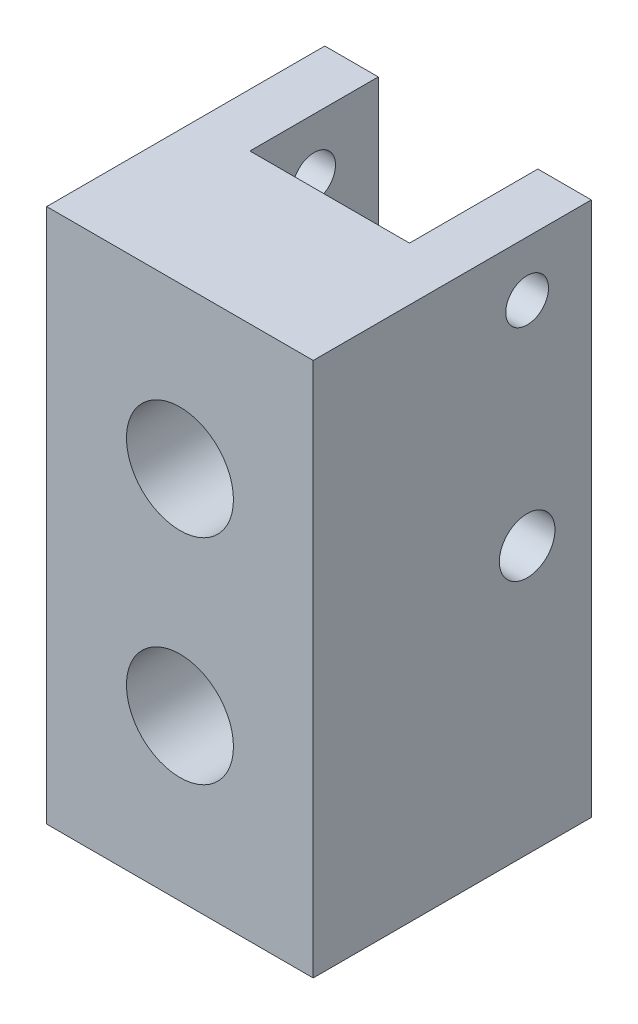
ISO-10303-21;
HEADER;
FILE_DESCRIPTION(('STEP AP214'),'2;1');
FILE_NAME('part.step','',(''),(''),'','','');
FILE_SCHEMA(('AUTOMOTIVE_DESIGN { 1 0 10303 214 1 1 1 1 }'));
ENDSEC;
DATA;
#1=APPLICATION_CONTEXT('core data for automotive mechanical design processes');
#2=APPLICATION_PROTOCOL_DEFINITION('international standard','automotive_design',2000,#1);
#3=PRODUCT_CONTEXT('',#1,'mechanical');
#4=PRODUCT('Part','Part','',(#3));
#5=PRODUCT_RELATED_PRODUCT_CATEGORY('part','',(#4));
#6=PRODUCT_DEFINITION_FORMATION('','',#4);
#7=PRODUCT_DEFINITION_CONTEXT('part definition',#1,'design');
#8=PRODUCT_DEFINITION('design','',#6,#7);
#9=PRODUCT_DEFINITION_SHAPE('','',#8);
#10=(LENGTH_UNIT() NAMED_UNIT(*) SI_UNIT(.MILLI.,.METRE.));
#11=(NAMED_UNIT(*) PLANE_ANGLE_UNIT() SI_UNIT($,.RADIAN.));
#12=(NAMED_UNIT(*) SI_UNIT($,.STERADIAN.) SOLID_ANGLE_UNIT());
#13=UNCERTAINTY_MEASURE_WITH_UNIT(LENGTH_MEASURE(1.E-05),#10,'distance_accuracy_value','');
#14=(GEOMETRIC_REPRESENTATION_CONTEXT(3) GLOBAL_UNCERTAINTY_ASSIGNED_CONTEXT((#13)) GLOBAL_UNIT_ASSIGNED_CONTEXT((#10,
#11,#12)) REPRESENTATION_CONTEXT('',''));
#15=CARTESIAN_POINT('',(0.,0.,0.));
#16=DIRECTION('',(0.,0.,1.));
#17=DIRECTION('',(1.,0.,0.));
#18=AXIS2_PLACEMENT_3D('',#15,#16,#17);
#19=CARTESIAN_POINT('',(31.6444206666666,63.5,0.));
#20=DIRECTION('',(0.,0.,-1.));
#21=DIRECTION('',(-1.,0.,0.));
#22=AXIS2_PLACEMENT_3D('',#19,#20,#21);
#23=PLANE('',#22);
#24=CARTESIAN_POINT('',(15.8222103333333,44.45,0.));
#25=DIRECTION('',(0.,0.,1.));
#26=DIRECTION('',(1.,0.,0.));
#27=AXIS2_PLACEMENT_3D('',#24,#25,#26);
#28=CIRCLE('',#27,6.35);
#29=CARTESIAN_POINT('',(22.1722103333333,44.45,0.));
#30=VERTEX_POINT('',#29);
#31=EDGE_CURVE('E188',#30,#30,#28,.T.);
#32=ORIENTED_EDGE('',*,*,#31,.F.);
#33=EDGE_LOOP('',(#32));
#34=FACE_BOUND('',#33,.T.);
#35=CARTESIAN_POINT('',(15.8222103333333,19.05,0.));
#36=DIRECTION('',(0.,0.,1.));
#37=DIRECTION('',(1.,0.,0.));
#38=AXIS2_PLACEMENT_3D('',#35,#36,#37);
#39=CIRCLE('',#38,6.35);
#40=CARTESIAN_POINT('',(22.1722103333333,19.05,0.));
#41=VERTEX_POINT('',#40);
#42=EDGE_CURVE('E195',#41,#41,#39,.T.);
#43=ORIENTED_EDGE('',*,*,#42,.F.);
#44=EDGE_LOOP('',(#43));
#45=FACE_BOUND('',#44,.T.);
#46=DIRECTION('',(1.,0.,0.));
#47=VECTOR('',#46,1.);
#48=CARTESIAN_POINT('',(31.6444206666666,0.,0.));
#49=LINE('',#48,#47);
#50=CARTESIAN_POINT('',(0.,0.,0.));
#51=VERTEX_POINT('',#50);
#52=CARTESIAN_POINT('',(31.6444206666666,0.,0.));
#53=VERTEX_POINT('',#52);
#54=EDGE_CURVE('E146',#51,#53,#49,.T.);
#55=ORIENTED_EDGE('',*,*,#54,.T.);
#56=DIRECTION('',(0.,-1.,0.));
#57=VECTOR('',#56,1.);
#58=CARTESIAN_POINT('',(31.6444206666666,63.5,0.));
#59=LINE('',#58,#57);
#60=CARTESIAN_POINT('',(31.6444206666666,63.5,0.));
#61=VERTEX_POINT('',#60);
#62=EDGE_CURVE('E11',#61,#53,#59,.T.);
#63=ORIENTED_EDGE('',*,*,#62,.F.);
#64=DIRECTION('',(1.,0.,0.));
#65=VECTOR('',#64,1.);
#66=CARTESIAN_POINT('',(31.6444206666666,63.5,0.));
#67=LINE('',#66,#65);
#68=CARTESIAN_POINT('',(0.,63.5,0.));
#69=VERTEX_POINT('',#68);
#70=EDGE_CURVE('E168',#69,#61,#67,.T.);
#71=ORIENTED_EDGE('',*,*,#70,.F.);
#72=DIRECTION('',(0.,-1.,0.));
#73=VECTOR('',#72,1.);
#74=CARTESIAN_POINT('',(0.,63.5,0.));
#75=LINE('',#74,#73);
#76=EDGE_CURVE('E142',#69,#51,#75,.T.);
#77=ORIENTED_EDGE('',*,*,#76,.T.);
#78=EDGE_LOOP('',(#55,#63,#71,#77));
#79=FACE_BOUND('',#78,.T.);
#80=ADVANCED_FACE('F43',(#34,#45,#79),#23,.F.);
#81=CARTESIAN_POINT('',(31.6444206666666,63.5,0.));
#82=DIRECTION('',(-1.,0.,0.));
#83=DIRECTION('',(0.,0.,1.));
#84=AXIS2_PLACEMENT_3D('',#81,#82,#83);
#85=PLANE('',#84);
#86=CARTESIAN_POINT('',(31.6444206666666,31.75,-25.4));
#87=DIRECTION('',(1.,0.,0.));
#88=DIRECTION('',(0.,0.,-1.));
#89=AXIS2_PLACEMENT_3D('',#86,#87,#88);
#90=CIRCLE('',#89,3.302);
#91=CARTESIAN_POINT('',(31.6444206666666,31.75,-28.702));
#92=VERTEX_POINT('',#91);
#93=EDGE_CURVE('E310',#92,#92,#90,.T.);
#94=ORIENTED_EDGE('',*,*,#93,.F.);
#95=EDGE_LOOP('',(#94));
#96=FACE_BOUND('',#95,.T.);
#97=CARTESIAN_POINT('',(31.6444206666666,56.9899924781986,-25.4));
#98=DIRECTION('',(1.,0.,0.));
#99=DIRECTION('',(0.,0.,-1.));
#100=AXIS2_PLACEMENT_3D('',#97,#98,#99);
#101=CIRCLE('',#100,2.54);
#102=CARTESIAN_POINT('',(31.6444206666666,56.9899924781986,-27.94));
#103=VERTEX_POINT('',#102);
#104=EDGE_CURVE('E311',#103,#103,#101,.T.);
#105=ORIENTED_EDGE('',*,*,#104,.F.);
#106=EDGE_LOOP('',(#105));
#107=FACE_BOUND('',#106,.T.);
#108=DIRECTION('',(0.,0.,-1.));
#109=VECTOR('',#108,1.);
#110=CARTESIAN_POINT('',(31.6444206666666,0.,0.));
#111=LINE('',#110,#109);
#112=CARTESIAN_POINT('',(31.6444206666666,0.,-33.02));
#113=VERTEX_POINT('',#112);
#114=EDGE_CURVE('E150',#53,#113,#111,.T.);
#115=ORIENTED_EDGE('',*,*,#114,.T.);
#116=DIRECTION('',(0.,-1.,0.));
#117=VECTOR('',#116,1.);
#118=CARTESIAN_POINT('',(31.6444206666666,63.5,-33.02));
#119=LINE('',#118,#117);
#120=CARTESIAN_POINT('',(31.6444206666666,63.5,-33.02));
#121=VERTEX_POINT('',#120);
#122=EDGE_CURVE('E53',#121,#113,#119,.T.);
#123=ORIENTED_EDGE('',*,*,#122,.F.);
#124=DIRECTION('',(0.,0.,-1.));
#125=VECTOR('',#124,1.);
#126=CARTESIAN_POINT('',(31.6444206666666,63.5,0.));
#127=LINE('',#126,#125);
#128=EDGE_CURVE('E105',#61,#121,#127,.T.);
#129=ORIENTED_EDGE('',*,*,#128,.F.);
#130=ORIENTED_EDGE('',*,*,#62,.T.);
#131=EDGE_LOOP('',(#115,#123,#129,#130));
#132=FACE_BOUND('',#131,.T.);
#133=ADVANCED_FACE('F247',(#96,#107,#132),#85,.F.);
#134=CARTESIAN_POINT('',(31.6444206666666,63.5,-33.02));
#135=DIRECTION('',(0.,0.,1.));
#136=DIRECTION('',(1.,0.,0.));
#137=AXIS2_PLACEMENT_3D('',#134,#135,#136);
#138=PLANE('',#137);
#139=DIRECTION('',(-1.,0.,0.));
#140=VECTOR('',#139,1.);
#141=CARTESIAN_POINT('',(31.6444206666666,0.,-33.02));
#142=LINE('',#141,#140);
#143=CARTESIAN_POINT('',(25.2944206666666,0.,-33.02));
#144=VERTEX_POINT('',#143);
#145=EDGE_CURVE('E153',#113,#144,#142,.T.);
#146=ORIENTED_EDGE('',*,*,#145,.T.);
#147=DIRECTION('',(0.,-1.,0.));
#148=VECTOR('',#147,1.);
#149=CARTESIAN_POINT('',(25.2944206666666,63.5,-33.02));
#150=LINE('',#149,#148);
#151=CARTESIAN_POINT('',(25.2944206666666,63.5,-33.02));
#152=VERTEX_POINT('',#151);
#153=EDGE_CURVE('E179',#152,#144,#150,.T.);
#154=ORIENTED_EDGE('',*,*,#153,.F.);
#155=DIRECTION('',(-1.,0.,0.));
#156=VECTOR('',#155,1.);
#157=CARTESIAN_POINT('',(31.6444206666666,63.5,-33.02));
#158=LINE('',#157,#156);
#159=EDGE_CURVE('E210',#121,#152,#158,.T.);
#160=ORIENTED_EDGE('',*,*,#159,.F.);
#161=ORIENTED_EDGE('',*,*,#122,.T.);
#162=EDGE_LOOP('',(#146,#154,#160,#161));
#163=FACE_BOUND('',#162,.T.);
#164=ADVANCED_FACE('F252',(#163),#138,.F.);
#165=CARTESIAN_POINT('',(25.2944206666666,63.5,-33.02));
#166=DIRECTION('',(1.,0.,0.));
#167=DIRECTION('',(0.,0.,-1.));
#168=AXIS2_PLACEMENT_3D('',#165,#166,#167);
#169=PLANE('',#168);
#170=CARTESIAN_POINT('',(25.2944206666666,31.75,-25.4));
#171=DIRECTION('',(1.,0.,0.));
#172=DIRECTION('',(0.,0.,-1.));
#173=AXIS2_PLACEMENT_3D('',#170,#171,#172);
#174=CIRCLE('',#173,3.302);
#175=CARTESIAN_POINT('',(25.2944206666666,31.75,-28.702));
#176=VERTEX_POINT('',#175);
#177=EDGE_CURVE('E201',#176,#176,#174,.T.);
#178=ORIENTED_EDGE('',*,*,#177,.T.);
#179=EDGE_LOOP('',(#178));
#180=FACE_BOUND('',#179,.T.);
#181=CARTESIAN_POINT('',(25.2944206666666,56.9899924781986,-25.4));
#182=DIRECTION('',(1.,0.,0.));
#183=DIRECTION('',(0.,0.,-1.));
#184=AXIS2_PLACEMENT_3D('',#181,#182,#183);
#185=CIRCLE('',#184,2.54);
#186=CARTESIAN_POINT('',(25.2944206666666,56.9899924781986,-27.94));
#187=VERTEX_POINT('',#186);
#188=EDGE_CURVE('E295',#187,#187,#185,.T.);
#189=ORIENTED_EDGE('',*,*,#188,.T.);
#190=EDGE_LOOP('',(#189));
#191=FACE_BOUND('',#190,.T.);
#192=DIRECTION('',(0.,0.,1.));
#193=VECTOR('',#192,1.);
#194=CARTESIAN_POINT('',(25.2944206666666,0.,-33.02));
#195=LINE('',#194,#193);
#196=CARTESIAN_POINT('',(25.2944206666666,0.,-17.78));
#197=VERTEX_POINT('',#196);
#198=EDGE_CURVE('E156',#144,#197,#195,.T.);
#199=ORIENTED_EDGE('',*,*,#198,.T.);
#200=DIRECTION('',(0.,-1.,0.));
#201=VECTOR('',#200,1.);
#202=CARTESIAN_POINT('',(25.2944206666666,63.5,-17.78));
#203=LINE('',#202,#201);
#204=CARTESIAN_POINT('',(25.2944206666666,63.5,-17.78));
#205=VERTEX_POINT('',#204);
#206=EDGE_CURVE('E175',#205,#197,#203,.T.);
#207=ORIENTED_EDGE('',*,*,#206,.F.);
#208=DIRECTION('',(0.,0.,1.));
#209=VECTOR('',#208,1.);
#210=CARTESIAN_POINT('',(25.2944206666666,63.5,-33.02));
#211=LINE('',#210,#209);
#212=EDGE_CURVE('E213',#152,#205,#211,.T.);
#213=ORIENTED_EDGE('',*,*,#212,.F.);
#214=ORIENTED_EDGE('',*,*,#153,.T.);
#215=EDGE_LOOP('',(#199,#207,#213,#214));
#216=FACE_BOUND('',#215,.T.);
#217=ADVANCED_FACE('F221',(#180,#191,#216),#169,.F.);
#218=CARTESIAN_POINT('',(6.35,63.5,-17.78));
#219=DIRECTION('',(0.,0.,1.));
#220=DIRECTION('',(1.,0.,0.));
#221=AXIS2_PLACEMENT_3D('',#218,#219,#220);
#222=PLANE('',#221);
#223=CARTESIAN_POINT('',(15.8222103333333,44.45,-17.78));
#224=DIRECTION('',(0.,0.,1.));
#225=DIRECTION('',(1.,0.,0.));
#226=AXIS2_PLACEMENT_3D('',#223,#224,#225);
#227=CIRCLE('',#226,6.35);
#228=CARTESIAN_POINT('',(22.1722103333333,44.45,-17.78));
#229=VERTEX_POINT('',#228);
#230=EDGE_CURVE('E46',#229,#229,#227,.T.);
#231=ORIENTED_EDGE('',*,*,#230,.T.);
#232=EDGE_LOOP('',(#231));
#233=FACE_BOUND('',#232,.T.);
#234=CARTESIAN_POINT('',(15.8222103333333,19.05,-17.78));
#235=DIRECTION('',(0.,0.,1.));
#236=DIRECTION('',(1.,0.,0.));
#237=AXIS2_PLACEMENT_3D('',#234,#235,#236);
#238=CIRCLE('',#237,6.35);
#239=CARTESIAN_POINT('',(22.1722103333333,19.05,-17.78));
#240=VERTEX_POINT('',#239);
#241=EDGE_CURVE('E185',#240,#240,#238,.T.);
#242=ORIENTED_EDGE('',*,*,#241,.T.);
#243=EDGE_LOOP('',(#242));
#244=FACE_BOUND('',#243,.T.);
#245=DIRECTION('',(-1.,0.,0.));
#246=VECTOR('',#245,1.);
#247=CARTESIAN_POINT('',(6.35,0.,-17.78));
#248=LINE('',#247,#246);
#249=CARTESIAN_POINT('',(6.35,0.,-17.78));
#250=VERTEX_POINT('',#249);
#251=EDGE_CURVE('E159',#197,#250,#248,.T.);
#252=ORIENTED_EDGE('',*,*,#251,.T.);
#253=DIRECTION('',(0.,-1.,0.));
#254=VECTOR('',#253,1.);
#255=CARTESIAN_POINT('',(6.35,63.5,-17.78));
#256=LINE('',#255,#254);
#257=CARTESIAN_POINT('',(6.35,63.5,-17.78));
#258=VERTEX_POINT('',#257);
#259=EDGE_CURVE('E135',#258,#250,#256,.T.);
#260=ORIENTED_EDGE('',*,*,#259,.F.);
#261=DIRECTION('',(-1.,0.,0.));
#262=VECTOR('',#261,1.);
#263=CARTESIAN_POINT('',(6.35,63.5,-17.78));
#264=LINE('',#263,#262);
#265=EDGE_CURVE('E124',#205,#258,#264,.T.);
#266=ORIENTED_EDGE('',*,*,#265,.F.);
#267=ORIENTED_EDGE('',*,*,#206,.T.);
#268=EDGE_LOOP('',(#252,#260,#266,#267));
#269=FACE_BOUND('',#268,.T.);
#270=ADVANCED_FACE('F225',(#233,#244,#269),#222,.F.);
#271=CARTESIAN_POINT('',(6.35,63.5,-33.02));
#272=DIRECTION('',(-1.,0.,0.));
#273=DIRECTION('',(0.,0.,1.));
#274=AXIS2_PLACEMENT_3D('',#271,#272,#273);
#275=PLANE('',#274);
#276=CARTESIAN_POINT('',(6.35,31.75,-25.4));
#277=DIRECTION('',(-1.,0.,0.));
#278=DIRECTION('',(0.,0.,1.));
#279=AXIS2_PLACEMENT_3D('',#276,#277,#278);
#280=CIRCLE('',#279,3.302);
#281=CARTESIAN_POINT('',(6.35,31.75,-28.702));
#282=VERTEX_POINT('',#281);
#283=EDGE_CURVE('E292',#282,#282,#280,.T.);
#284=ORIENTED_EDGE('',*,*,#283,.T.);
#285=EDGE_LOOP('',(#284));
#286=FACE_BOUND('',#285,.T.);
#287=CARTESIAN_POINT('',(6.35,56.9899924781986,-25.4));
#288=DIRECTION('',(-1.,0.,0.));
#289=DIRECTION('',(0.,0.,1.));
#290=AXIS2_PLACEMENT_3D('',#287,#288,#289);
#291=CIRCLE('',#290,2.54);
#292=CARTESIAN_POINT('',(6.35,56.9899924781986,-27.94));
#293=VERTEX_POINT('',#292);
#294=EDGE_CURVE('E300',#293,#293,#291,.T.);
#295=ORIENTED_EDGE('',*,*,#294,.T.);
#296=EDGE_LOOP('',(#295));
#297=FACE_BOUND('',#296,.T.);
#298=DIRECTION('',(0.,0.,-1.));
#299=VECTOR('',#298,1.);
#300=CARTESIAN_POINT('',(6.35,0.,-33.02));
#301=LINE('',#300,#299);
#302=CARTESIAN_POINT('',(6.35,0.,-33.02));
#303=VERTEX_POINT('',#302);
#304=EDGE_CURVE('E133',#250,#303,#301,.T.);
#305=ORIENTED_EDGE('',*,*,#304,.T.);
#306=DIRECTION('',(0.,-1.,0.));
#307=VECTOR('',#306,1.);
#308=CARTESIAN_POINT('',(6.35,63.5,-33.02));
#309=LINE('',#308,#307);
#310=CARTESIAN_POINT('',(6.35,63.5,-33.02));
#311=VERTEX_POINT('',#310);
#312=EDGE_CURVE('E130',#311,#303,#309,.T.);
#313=ORIENTED_EDGE('',*,*,#312,.F.);
#314=DIRECTION('',(0.,0.,-1.));
#315=VECTOR('',#314,1.);
#316=CARTESIAN_POINT('',(6.35,63.5,-33.02));
#317=LINE('',#316,#315);
#318=EDGE_CURVE('E118',#258,#311,#317,.T.);
#319=ORIENTED_EDGE('',*,*,#318,.F.);
#320=ORIENTED_EDGE('',*,*,#259,.T.);
#321=EDGE_LOOP('',(#305,#313,#319,#320));
#322=FACE_BOUND('',#321,.T.);
#323=ADVANCED_FACE('F131',(#286,#297,#322),#275,.F.);
#324=CARTESIAN_POINT('',(0.,63.5,-33.02));
#325=DIRECTION('',(0.,0.,1.));
#326=DIRECTION('',(1.,0.,0.));
#327=AXIS2_PLACEMENT_3D('',#324,#325,#326);
#328=PLANE('',#327);
#329=DIRECTION('',(-1.,0.,0.));
#330=VECTOR('',#329,1.);
#331=CARTESIAN_POINT('',(0.,0.,-33.02));
#332=LINE('',#331,#330);
#333=CARTESIAN_POINT('',(0.,0.,-33.02));
#334=VERTEX_POINT('',#333);
#335=EDGE_CURVE('E91',#303,#334,#332,.T.);
#336=ORIENTED_EDGE('',*,*,#335,.T.);
#337=DIRECTION('',(0.,-1.,0.));
#338=VECTOR('',#337,1.);
#339=CARTESIAN_POINT('',(0.,63.5,-33.02));
#340=LINE('',#339,#338);
#341=CARTESIAN_POINT('',(0.,63.5,-33.02));
#342=VERTEX_POINT('',#341);
#343=EDGE_CURVE('E136',#342,#334,#340,.T.);
#344=ORIENTED_EDGE('',*,*,#343,.F.);
#345=DIRECTION('',(-1.,0.,0.));
#346=VECTOR('',#345,1.);
#347=CARTESIAN_POINT('',(0.,63.5,-33.02));
#348=LINE('',#347,#346);
#349=EDGE_CURVE('E122',#311,#342,#348,.T.);
#350=ORIENTED_EDGE('',*,*,#349,.F.);
#351=ORIENTED_EDGE('',*,*,#312,.T.);
#352=EDGE_LOOP('',(#336,#344,#350,#351));
#353=FACE_BOUND('',#352,.T.);
#354=ADVANCED_FACE('F138',(#353),#328,.F.);
#355=CARTESIAN_POINT('',(0.,63.5,0.));
#356=DIRECTION('',(1.,0.,0.));
#357=DIRECTION('',(0.,0.,-1.));
#358=AXIS2_PLACEMENT_3D('',#355,#356,#357);
#359=PLANE('',#358);
#360=CARTESIAN_POINT('',(0.,31.75,-25.4));
#361=DIRECTION('',(1.,0.,0.));
#362=DIRECTION('',(0.,0.,-1.));
#363=AXIS2_PLACEMENT_3D('',#360,#361,#362);
#364=CIRCLE('',#363,3.302);
#365=CARTESIAN_POINT('',(0.,31.75,-28.702));
#366=VERTEX_POINT('',#365);
#367=EDGE_CURVE('E289',#366,#366,#364,.T.);
#368=ORIENTED_EDGE('',*,*,#367,.T.);
#369=EDGE_LOOP('',(#368));
#370=FACE_BOUND('',#369,.T.);
#371=CARTESIAN_POINT('',(0.,56.9899924781986,-25.4));
#372=DIRECTION('',(1.,0.,0.));
#373=DIRECTION('',(0.,0.,-1.));
#374=AXIS2_PLACEMENT_3D('',#371,#372,#373);
#375=CIRCLE('',#374,2.54);
#376=CARTESIAN_POINT('',(0.,56.9899924781986,-27.94));
#377=VERTEX_POINT('',#376);
#378=EDGE_CURVE('E306',#377,#377,#375,.T.);
#379=ORIENTED_EDGE('',*,*,#378,.T.);
#380=EDGE_LOOP('',(#379));
#381=FACE_BOUND('',#380,.T.);
#382=DIRECTION('',(0.,0.,1.));
#383=VECTOR('',#382,1.);
#384=CARTESIAN_POINT('',(0.,0.,0.));
#385=LINE('',#384,#383);
#386=EDGE_CURVE('E97',#334,#51,#385,.T.);
#387=ORIENTED_EDGE('',*,*,#386,.T.);
#388=ORIENTED_EDGE('',*,*,#76,.F.);
#389=DIRECTION('',(0.,0.,1.));
#390=VECTOR('',#389,1.);
#391=CARTESIAN_POINT('',(0.,63.5,0.));
#392=LINE('',#391,#390);
#393=EDGE_CURVE('E62',#342,#69,#392,.T.);
#394=ORIENTED_EDGE('',*,*,#393,.F.);
#395=ORIENTED_EDGE('',*,*,#343,.T.);
#396=EDGE_LOOP('',(#387,#388,#394,#395));
#397=FACE_BOUND('',#396,.T.);
#398=ADVANCED_FACE('F233',(#370,#381,#397),#359,.F.);
#399=CARTESIAN_POINT('',(0.,63.5,0.));
#400=DIRECTION('',(0.,-1.,0.));
#401=DIRECTION('',(0.,0.,-1.));
#402=AXIS2_PLACEMENT_3D('',#399,#400,#401);
#403=PLANE('',#402);
#404=ORIENTED_EDGE('',*,*,#70,.T.);
#405=ORIENTED_EDGE('',*,*,#128,.T.);
#406=ORIENTED_EDGE('',*,*,#159,.T.);
#407=ORIENTED_EDGE('',*,*,#212,.T.);
#408=ORIENTED_EDGE('',*,*,#265,.T.);
#409=ORIENTED_EDGE('',*,*,#318,.T.);
#410=ORIENTED_EDGE('',*,*,#349,.T.);
#411=ORIENTED_EDGE('',*,*,#393,.T.);
#412=EDGE_LOOP('',(#404,#405,#406,#407,#408,#409,#410,#411));
#413=FACE_BOUND('',#412,.T.);
#414=ADVANCED_FACE('F120',(#413),#403,.F.);
#415=CARTESIAN_POINT('',(0.,0.,0.));
#416=DIRECTION('',(0.,-1.,0.));
#417=DIRECTION('',(0.,0.,-1.));
#418=AXIS2_PLACEMENT_3D('',#415,#416,#417);
#419=PLANE('',#418);
#420=ORIENTED_EDGE('',*,*,#54,.F.);
#421=ORIENTED_EDGE('',*,*,#386,.F.);
#422=ORIENTED_EDGE('',*,*,#335,.F.);
#423=ORIENTED_EDGE('',*,*,#304,.F.);
#424=ORIENTED_EDGE('',*,*,#251,.F.);
#425=ORIENTED_EDGE('',*,*,#198,.F.);
#426=ORIENTED_EDGE('',*,*,#145,.F.);
#427=ORIENTED_EDGE('',*,*,#114,.F.);
#428=EDGE_LOOP('',(#420,#421,#422,#423,#424,#425,#426,#427));
#429=FACE_BOUND('',#428,.T.);
#430=ADVANCED_FACE('F228',(#429),#419,.T.);
#431=CARTESIAN_POINT('',(15.8222103333333,19.05,-33.02));
#432=DIRECTION('',(0.,0.,1.));
#433=DIRECTION('',(1.,0.,0.));
#434=AXIS2_PLACEMENT_3D('',#431,#432,#433);
#435=CYLINDRICAL_SURFACE('',#434,6.35);
#436=ORIENTED_EDGE('',*,*,#42,.T.);
#437=EDGE_LOOP('',(#436));
#438=FACE_BOUND('',#437,.T.);
#439=ORIENTED_EDGE('',*,*,#241,.F.);
#440=EDGE_LOOP('',(#439));
#441=FACE_BOUND('',#440,.T.);
#442=ADVANCED_FACE('F257',(#438,#441),#435,.F.);
#443=CARTESIAN_POINT('',(15.8222103333333,44.45,-33.02));
#444=DIRECTION('',(0.,0.,1.));
#445=DIRECTION('',(1.,0.,0.));
#446=AXIS2_PLACEMENT_3D('',#443,#444,#445);
#447=CYLINDRICAL_SURFACE('',#446,6.35);
#448=ORIENTED_EDGE('',*,*,#31,.T.);
#449=EDGE_LOOP('',(#448));
#450=FACE_BOUND('',#449,.T.);
#451=ORIENTED_EDGE('',*,*,#230,.F.);
#452=EDGE_LOOP('',(#451));
#453=FACE_BOUND('',#452,.T.);
#454=ADVANCED_FACE('F260',(#450,#453),#447,.F.);
#455=CARTESIAN_POINT('',(0.,56.9899924781986,-25.4));
#456=DIRECTION('',(1.,0.,0.));
#457=DIRECTION('',(0.,0.,-1.));
#458=AXIS2_PLACEMENT_3D('',#455,#456,#457);
#459=CYLINDRICAL_SURFACE('',#458,2.54);
#460=CARTESIAN_POINT('',(0.,56.9899924781986,-27.94));
#461=CARTESIAN_POINT('',(0.0661458333333296,56.9899924781986,-27.94));
#462=CARTESIAN_POINT('',(0.132291666666663,56.9899924781986,-27.94));
#463=CARTESIAN_POINT('',(0.26458333333333,56.9899924781986,-27.94));
#464=CARTESIAN_POINT('',(0.330729166666663,56.9899924781986,-27.94));
#465=CARTESIAN_POINT('',(0.46302083333333,56.9899924781986,-27.94));
#466=CARTESIAN_POINT('',(0.529166666666663,56.9899924781986,-27.94));
#467=CARTESIAN_POINT('',(0.66145833333333,56.9899924781986,-27.94));
#468=CARTESIAN_POINT('',(0.727604166666663,56.9899924781986,-27.94));
#469=CARTESIAN_POINT('',(0.85989583333333,56.9899924781986,-27.94));
#470=CARTESIAN_POINT('',(0.926041666666663,56.9899924781986,-27.94));
#471=CARTESIAN_POINT('',(1.05833333333333,56.9899924781986,-27.94));
#472=CARTESIAN_POINT('',(1.12447916666666,56.9899924781986,-27.94));
#473=CARTESIAN_POINT('',(1.25677083333333,56.9899924781986,-27.94));
#474=CARTESIAN_POINT('',(1.32291666666666,56.9899924781986,-27.94));
#475=CARTESIAN_POINT('',(1.45520833333333,56.9899924781986,-27.94));
#476=CARTESIAN_POINT('',(1.52135416666666,56.9899924781986,-27.94));
#477=CARTESIAN_POINT('',(1.65364583333333,56.9899924781986,-27.94));
#478=CARTESIAN_POINT('',(1.71979166666666,56.9899924781986,-27.94));
#479=CARTESIAN_POINT('',(1.85208333333333,56.9899924781986,-27.94));
#480=CARTESIAN_POINT('',(1.91822916666666,56.9899924781986,-27.94));
#481=CARTESIAN_POINT('',(2.05052083333333,56.9899924781986,-27.94));
#482=CARTESIAN_POINT('',(2.11666666666666,56.9899924781986,-27.94));
#483=CARTESIAN_POINT('',(2.24895833333333,56.9899924781986,-27.94));
#484=CARTESIAN_POINT('',(2.31510416666666,56.9899924781986,-27.94));
#485=CARTESIAN_POINT('',(2.44739583333333,56.9899924781986,-27.94));
#486=CARTESIAN_POINT('',(2.51354166666666,56.9899924781986,-27.94));
#487=CARTESIAN_POINT('',(2.64583333333333,56.9899924781986,-27.94));
#488=CARTESIAN_POINT('',(2.71197916666666,56.9899924781986,-27.94));
#489=CARTESIAN_POINT('',(2.84427083333333,56.9899924781986,-27.94));
#490=CARTESIAN_POINT('',(2.91041666666666,56.9899924781986,-27.94));
#491=CARTESIAN_POINT('',(3.04270833333333,56.9899924781986,-27.94));
#492=CARTESIAN_POINT('',(3.10885416666666,56.9899924781986,-27.94));
#493=CARTESIAN_POINT('',(3.24114583333333,56.9899924781986,-27.94));
#494=CARTESIAN_POINT('',(3.30729166666667,56.9899924781986,-27.94));
#495=CARTESIAN_POINT('',(3.43958333333333,56.9899924781986,-27.94));
#496=CARTESIAN_POINT('',(3.50572916666667,56.9899924781986,-27.94));
#497=CARTESIAN_POINT('',(3.63802083333333,56.9899924781986,-27.94));
#498=CARTESIAN_POINT('',(3.70416666666667,56.9899924781986,-27.94));
#499=CARTESIAN_POINT('',(3.83645833333333,56.9899924781986,-27.94));
#500=CARTESIAN_POINT('',(3.90260416666667,56.9899924781986,-27.94));
#501=CARTESIAN_POINT('',(4.03489583333333,56.9899924781986,-27.94));
#502=CARTESIAN_POINT('',(4.10104166666667,56.9899924781986,-27.94));
#503=CARTESIAN_POINT('',(4.23333333333333,56.9899924781986,-27.94));
#504=CARTESIAN_POINT('',(4.29947916666667,56.9899924781986,-27.94));
#505=CARTESIAN_POINT('',(4.43177083333333,56.9899924781986,-27.94));
#506=CARTESIAN_POINT('',(4.49791666666667,56.9899924781986,-27.94));
#507=CARTESIAN_POINT('',(4.63020833333333,56.9899924781986,-27.94));
#508=CARTESIAN_POINT('',(4.69635416666667,56.9899924781986,-27.94));
#509=CARTESIAN_POINT('',(4.82864583333333,56.9899924781986,-27.94));
#510=CARTESIAN_POINT('',(4.89479166666667,56.9899924781986,-27.94));
#511=CARTESIAN_POINT('',(5.02708333333333,56.9899924781986,-27.94));
#512=CARTESIAN_POINT('',(5.09322916666667,56.9899924781986,-27.94));
#513=CARTESIAN_POINT('',(5.22552083333333,56.9899924781986,-27.94));
#514=CARTESIAN_POINT('',(5.29166666666667,56.9899924781986,-27.94));
#515=CARTESIAN_POINT('',(5.42395833333333,56.9899924781986,-27.94));
#516=CARTESIAN_POINT('',(5.49010416666667,56.9899924781986,-27.94));
#517=CARTESIAN_POINT('',(5.62239583333333,56.9899924781986,-27.94));
#518=CARTESIAN_POINT('',(5.68854166666667,56.9899924781986,-27.94));
#519=CARTESIAN_POINT('',(5.82083333333333,56.9899924781986,-27.94));
#520=CARTESIAN_POINT('',(5.88697916666667,56.9899924781986,-27.94));
#521=CARTESIAN_POINT('',(6.01927083333333,56.9899924781986,-27.94));
#522=CARTESIAN_POINT('',(6.08541666666667,56.9899924781986,-27.94));
#523=CARTESIAN_POINT('',(6.21770833333333,56.9899924781986,-27.94));
#524=CARTESIAN_POINT('',(6.28385416666667,56.9899924781986,-27.94));
#525=CARTESIAN_POINT('',(6.35,56.9899924781986,-27.94));
#526=B_SPLINE_CURVE_WITH_KNOTS('',3,(#460,#461,#462,#463,#464,#465,#466,#467,#468,#469,#470,
#471,#472,#473,#474,#475,#476,#477,#478,#479,#480,#481,#482,#483,#484,#485,#486,#487,#488,#489,
#490,#491,#492,#493,#494,#495,#496,#497,#498,#499,#500,#501,#502,#503,#504,#505,#506,#507,#508,
#509,#510,#511,#512,#513,#514,#515,#516,#517,#518,#519,#520,#521,#522,#523,#524,#525),
.UNSPECIFIED.,.F.,.F.,(4,2,2,2,2,2,2,2,2,2,2,2,2,2,2,2,2,2,2,2,2,2,2,2,2,2,2,2,2,2,2,2,4),(0.,
0.1984375,0.396875,0.5953125,0.793750000000001,0.9921875,1.190625,1.3890625,1.5875,1.7859375,
1.984375,2.1828125,2.38125,2.5796875,2.778125,2.9765625,3.175,3.3734375,3.571875,3.7703125,
3.96875,4.1671875,4.365625,4.5640625,4.7625,4.9609375,5.159375,5.3578125,5.55625,5.7546875,
5.953125,6.1515625,6.35),.UNSPECIFIED.);
#527=EDGE_CURVE('BSEAM266',#377,#293,#526,.T.);
#528=ORIENTED_EDGE('',*,*,#378,.F.);
#529=ORIENTED_EDGE('',*,*,#294,.F.);
#530=ORIENTED_EDGE('',*,*,#527,.T.);
#531=ORIENTED_EDGE('',*,*,#527,.F.);
#532=EDGE_LOOP('',(#528,#530,#529,#531));
#533=FACE_BOUND('',#532,.T.);
#534=ADVANCED_FACE('F266',(#533),#459,.F.);
#535=CARTESIAN_POINT('',(0.,31.75,-25.4));
#536=DIRECTION('',(1.,0.,0.));
#537=DIRECTION('',(0.,0.,-1.));
#538=AXIS2_PLACEMENT_3D('',#535,#536,#537);
#539=CYLINDRICAL_SURFACE('',#538,3.302);
#540=CARTESIAN_POINT('',(0.,31.75,-28.702));
#541=CARTESIAN_POINT('',(0.0661458333333296,31.75,-28.702));
#542=CARTESIAN_POINT('',(0.132291666666663,31.75,-28.702));
#543=CARTESIAN_POINT('',(0.26458333333333,31.75,-28.702));
#544=CARTESIAN_POINT('',(0.330729166666663,31.75,-28.702));
#545=CARTESIAN_POINT('',(0.46302083333333,31.75,-28.702));
#546=CARTESIAN_POINT('',(0.529166666666663,31.75,-28.702));
#547=CARTESIAN_POINT('',(0.66145833333333,31.75,-28.702));
#548=CARTESIAN_POINT('',(0.727604166666663,31.75,-28.702));
#549=CARTESIAN_POINT('',(0.85989583333333,31.75,-28.702));
#550=CARTESIAN_POINT('',(0.926041666666664,31.75,-28.702));
#551=CARTESIAN_POINT('',(1.05833333333333,31.75,-28.702));
#552=CARTESIAN_POINT('',(1.12447916666666,31.75,-28.702));
#553=CARTESIAN_POINT('',(1.25677083333333,31.75,-28.702));
#554=CARTESIAN_POINT('',(1.32291666666666,31.75,-28.702));
#555=CARTESIAN_POINT('',(1.45520833333333,31.75,-28.702));
#556=CARTESIAN_POINT('',(1.52135416666666,31.75,-28.702));
#557=CARTESIAN_POINT('',(1.65364583333333,31.75,-28.702));
#558=CARTESIAN_POINT('',(1.71979166666666,31.75,-28.702));
#559=CARTESIAN_POINT('',(1.85208333333333,31.75,-28.702));
#560=CARTESIAN_POINT('',(1.91822916666666,31.75,-28.702));
#561=CARTESIAN_POINT('',(2.05052083333333,31.75,-28.702));
#562=CARTESIAN_POINT('',(2.11666666666666,31.75,-28.702));
#563=CARTESIAN_POINT('',(2.24895833333333,31.75,-28.702));
#564=CARTESIAN_POINT('',(2.31510416666666,31.75,-28.702));
#565=CARTESIAN_POINT('',(2.44739583333333,31.75,-28.702));
#566=CARTESIAN_POINT('',(2.51354166666667,31.75,-28.702));
#567=CARTESIAN_POINT('',(2.64583333333333,31.75,-28.702));
#568=CARTESIAN_POINT('',(2.71197916666667,31.75,-28.702));
#569=CARTESIAN_POINT('',(2.84427083333333,31.75,-28.702));
#570=CARTESIAN_POINT('',(2.91041666666667,31.75,-28.702));
#571=CARTESIAN_POINT('',(3.04270833333333,31.75,-28.702));
#572=CARTESIAN_POINT('',(3.10885416666667,31.75,-28.702));
#573=CARTESIAN_POINT('',(3.24114583333333,31.75,-28.702));
#574=CARTESIAN_POINT('',(3.30729166666667,31.75,-28.702));
#575=CARTESIAN_POINT('',(3.43958333333333,31.75,-28.702));
#576=CARTESIAN_POINT('',(3.50572916666667,31.75,-28.702));
#577=CARTESIAN_POINT('',(3.63802083333333,31.75,-28.702));
#578=CARTESIAN_POINT('',(3.70416666666667,31.75,-28.702));
#579=CARTESIAN_POINT('',(3.83645833333333,31.75,-28.702));
#580=CARTESIAN_POINT('',(3.90260416666667,31.75,-28.702));
#581=CARTESIAN_POINT('',(4.03489583333333,31.75,-28.702));
#582=CARTESIAN_POINT('',(4.10104166666667,31.75,-28.702));
#583=CARTESIAN_POINT('',(4.23333333333333,31.75,-28.702));
#584=CARTESIAN_POINT('',(4.29947916666667,31.75,-28.702));
#585=CARTESIAN_POINT('',(4.43177083333333,31.75,-28.702));
#586=CARTESIAN_POINT('',(4.49791666666667,31.75,-28.702));
#587=CARTESIAN_POINT('',(4.63020833333333,31.75,-28.702));
#588=CARTESIAN_POINT('',(4.69635416666667,31.75,-28.702));
#589=CARTESIAN_POINT('',(4.82864583333333,31.75,-28.702));
#590=CARTESIAN_POINT('',(4.89479166666667,31.75,-28.702));
#591=CARTESIAN_POINT('',(5.02708333333333,31.75,-28.702));
#592=CARTESIAN_POINT('',(5.09322916666667,31.75,-28.702));
#593=CARTESIAN_POINT('',(5.22552083333333,31.75,-28.702));
#594=CARTESIAN_POINT('',(5.29166666666667,31.75,-28.702));
#595=CARTESIAN_POINT('',(5.42395833333333,31.75,-28.702));
#596=CARTESIAN_POINT('',(5.49010416666667,31.75,-28.702));
#597=CARTESIAN_POINT('',(5.62239583333333,31.75,-28.702));
#598=CARTESIAN_POINT('',(5.68854166666667,31.75,-28.702));
#599=CARTESIAN_POINT('',(5.82083333333333,31.75,-28.702));
#600=CARTESIAN_POINT('',(5.88697916666667,31.75,-28.702));
#601=CARTESIAN_POINT('',(6.01927083333333,31.75,-28.702));
#602=CARTESIAN_POINT('',(6.08541666666667,31.75,-28.702));
#603=CARTESIAN_POINT('',(6.21770833333333,31.75,-28.702));
#604=CARTESIAN_POINT('',(6.28385416666667,31.75,-28.702));
#605=CARTESIAN_POINT('',(6.35,31.75,-28.702));
#606=B_SPLINE_CURVE_WITH_KNOTS('',3,(#540,#541,#542,#543,#544,#545,#546,#547,#548,#549,#550,
#551,#552,#553,#554,#555,#556,#557,#558,#559,#560,#561,#562,#563,#564,#565,#566,#567,#568,#569,
#570,#571,#572,#573,#574,#575,#576,#577,#578,#579,#580,#581,#582,#583,#584,#585,#586,#587,#588,
#589,#590,#591,#592,#593,#594,#595,#596,#597,#598,#599,#600,#601,#602,#603,#604,#605),
.UNSPECIFIED.,.F.,.F.,(4,2,2,2,2,2,2,2,2,2,2,2,2,2,2,2,2,2,2,2,2,2,2,2,2,2,2,2,2,2,2,2,4),(0.,
0.1984375,0.396875,0.595312500000001,0.793750000000001,0.992187500000001,1.190625,1.3890625,
1.5875,1.7859375,1.984375,2.1828125,2.38125,2.5796875,2.778125,2.9765625,3.175,3.3734375,
3.571875,3.7703125,3.96875,4.1671875,4.365625,4.5640625,4.7625,4.9609375,5.159375,5.3578125,
5.55625,5.75468750000001,5.95312500000001,6.15156250000001,6.35000000000001),.UNSPECIFIED.);
#607=EDGE_CURVE('BSEAM273',#366,#282,#606,.T.);
#608=ORIENTED_EDGE('',*,*,#367,.F.);
#609=ORIENTED_EDGE('',*,*,#283,.F.);
#610=ORIENTED_EDGE('',*,*,#607,.T.);
#611=ORIENTED_EDGE('',*,*,#607,.F.);
#612=EDGE_LOOP('',(#608,#610,#609,#611));
#613=FACE_BOUND('',#612,.T.);
#614=ADVANCED_FACE('F273',(#613),#539,.F.);
#615=CARTESIAN_POINT('',(31.6444206666666,56.9899924781986,-27.94));
#616=CARTESIAN_POINT('',(31.5782748333333,56.9899924781986,-27.94));
#617=CARTESIAN_POINT('',(31.512129,56.9899924781986,-27.94));
#618=CARTESIAN_POINT('',(31.3798373333333,56.9899924781986,-27.94));
#619=CARTESIAN_POINT('',(31.3136915,56.9899924781986,-27.94));
#620=CARTESIAN_POINT('',(31.1813998333333,56.9899924781986,-27.94));
#621=CARTESIAN_POINT('',(31.115254,56.9899924781986,-27.94));
#622=CARTESIAN_POINT('',(30.9829623333333,56.9899924781986,-27.94));
#623=CARTESIAN_POINT('',(30.9168165,56.9899924781986,-27.94));
#624=CARTESIAN_POINT('',(30.7845248333333,56.9899924781986,-27.94));
#625=CARTESIAN_POINT('',(30.718379,56.9899924781986,-27.94));
#626=CARTESIAN_POINT('',(30.5860873333333,56.9899924781986,-27.94));
#627=CARTESIAN_POINT('',(30.5199415,56.9899924781986,-27.94));
#628=CARTESIAN_POINT('',(30.3876498333333,56.9899924781986,-27.94));
#629=CARTESIAN_POINT('',(30.321504,56.9899924781986,-27.94));
#630=CARTESIAN_POINT('',(30.1892123333333,56.9899924781986,-27.94));
#631=CARTESIAN_POINT('',(30.1230665,56.9899924781986,-27.94));
#632=CARTESIAN_POINT('',(29.9907748333333,56.9899924781986,-27.94));
#633=CARTESIAN_POINT('',(29.924629,56.9899924781986,-27.94));
#634=CARTESIAN_POINT('',(29.7923373333333,56.9899924781986,-27.94));
#635=CARTESIAN_POINT('',(29.7261915,56.9899924781986,-27.94));
#636=CARTESIAN_POINT('',(29.5938998333333,56.9899924781986,-27.94));
#637=CARTESIAN_POINT('',(29.527754,56.9899924781986,-27.94));
#638=CARTESIAN_POINT('',(29.3954623333333,56.9899924781986,-27.94));
#639=CARTESIAN_POINT('',(29.3293165,56.9899924781986,-27.94));
#640=CARTESIAN_POINT('',(29.1970248333333,56.9899924781986,-27.94));
#641=CARTESIAN_POINT('',(29.130879,56.9899924781986,-27.94));
#642=CARTESIAN_POINT('',(28.9985873333333,56.9899924781986,-27.94));
#643=CARTESIAN_POINT('',(28.9324415,56.9899924781986,-27.94));
#644=CARTESIAN_POINT('',(28.8001498333333,56.9899924781986,-27.94));
#645=CARTESIAN_POINT('',(28.734004,56.9899924781986,-27.94));
#646=CARTESIAN_POINT('',(28.6017123333333,56.9899924781986,-27.94));
#647=CARTESIAN_POINT('',(28.5355665,56.9899924781986,-27.94));
#648=CARTESIAN_POINT('',(28.4032748333333,56.9899924781986,-27.94));
#649=CARTESIAN_POINT('',(28.337129,56.9899924781986,-27.94));
#650=CARTESIAN_POINT('',(28.2048373333333,56.9899924781986,-27.94));
#651=CARTESIAN_POINT('',(28.1386915,56.9899924781986,-27.94));
#652=CARTESIAN_POINT('',(28.0063998333333,56.9899924781986,-27.94));
#653=CARTESIAN_POINT('',(27.940254,56.9899924781986,-27.94));
#654=CARTESIAN_POINT('',(27.8079623333333,56.9899924781986,-27.94));
#655=CARTESIAN_POINT('',(27.7418165,56.9899924781986,-27.94));
#656=CARTESIAN_POINT('',(27.6095248333333,56.9899924781986,-27.94));
#657=CARTESIAN_POINT('',(27.543379,56.9899924781986,-27.94));
#658=CARTESIAN_POINT('',(27.4110873333333,56.9899924781986,-27.94));
#659=CARTESIAN_POINT('',(27.3449415,56.9899924781986,-27.94));
#660=CARTESIAN_POINT('',(27.2126498333333,56.9899924781986,-27.94));
#661=CARTESIAN_POINT('',(27.146504,56.9899924781986,-27.94));
#662=CARTESIAN_POINT('',(27.0142123333333,56.9899924781986,-27.94));
#663=CARTESIAN_POINT('',(26.9480665,56.9899924781986,-27.94));
#664=CARTESIAN_POINT('',(26.8157748333333,56.9899924781986,-27.94));
#665=CARTESIAN_POINT('',(26.749629,56.9899924781986,-27.94));
#666=CARTESIAN_POINT('',(26.6173373333333,56.9899924781986,-27.94));
#667=CARTESIAN_POINT('',(26.5511915,56.9899924781986,-27.94));
#668=CARTESIAN_POINT('',(26.4188998333333,56.9899924781986,-27.94));
#669=CARTESIAN_POINT('',(26.352754,56.9899924781986,-27.94));
#670=CARTESIAN_POINT('',(26.2204623333333,56.9899924781986,-27.94));
#671=CARTESIAN_POINT('',(26.1543165,56.9899924781986,-27.94));
#672=CARTESIAN_POINT('',(26.0220248333333,56.9899924781986,-27.94));
#673=CARTESIAN_POINT('',(25.955879,56.9899924781986,-27.94));
#674=CARTESIAN_POINT('',(25.8235873333333,56.9899924781986,-27.94));
#675=CARTESIAN_POINT('',(25.7574415,56.9899924781986,-27.94));
#676=CARTESIAN_POINT('',(25.6251498333333,56.9899924781986,-27.94));
#677=CARTESIAN_POINT('',(25.559004,56.9899924781986,-27.94));
#678=CARTESIAN_POINT('',(25.4267123333333,56.9899924781986,-27.94));
#679=CARTESIAN_POINT('',(25.3605665,56.9899924781986,-27.94));
#680=CARTESIAN_POINT('',(25.2944206666666,56.9899924781986,-27.94));
#681=B_SPLINE_CURVE_WITH_KNOTS('',3,(#615,#616,#617,#618,#619,#620,#621,#622,#623,#624,#625,
#626,#627,#628,#629,#630,#631,#632,#633,#634,#635,#636,#637,#638,#639,#640,#641,#642,#643,#644,
#645,#646,#647,#648,#649,#650,#651,#652,#653,#654,#655,#656,#657,#658,#659,#660,#661,#662,#663,
#664,#665,#666,#667,#668,#669,#670,#671,#672,#673,#674,#675,#676,#677,#678,#679,#680),
.UNSPECIFIED.,.F.,.F.,(4,2,2,2,2,2,2,2,2,2,2,2,2,2,2,2,2,2,2,2,2,2,2,2,2,2,2,2,2,2,2,2,4),(0.,
0.198437500000002,0.396874999999994,0.595312499999993,0.793749999999996,0.992187499999995,
1.19062499999999,1.3890625,1.5875,1.78593749999999,1.984375,2.1828125,2.38124999999999,
2.5796875,2.778125,2.9765625,3.175,3.3734375,3.571875,3.7703125,3.96875,4.1671875,4.365625,
4.5640625,4.7625,4.9609375,5.159375,5.3578125,5.55625,5.7546875,5.953125,6.1515625,6.35),.UNSPECIFIED.);
#682=EDGE_CURVE('BSEAM269',#103,#187,#681,.T.);
#683=ORIENTED_EDGE('',*,*,#104,.T.);
#684=ORIENTED_EDGE('',*,*,#188,.F.);
#685=ORIENTED_EDGE('',*,*,#682,.T.);
#686=ORIENTED_EDGE('',*,*,#682,.F.);
#687=EDGE_LOOP('',(#683,#685,#684,#686));
#688=FACE_BOUND('',#687,.T.);
#689=ADVANCED_FACE('F269',(#688),#459,.F.);
#690=CARTESIAN_POINT('',(31.6444206666666,31.75,-28.702));
#691=CARTESIAN_POINT('',(31.5782748333333,31.75,-28.702));
#692=CARTESIAN_POINT('',(31.512129,31.75,-28.702));
#693=CARTESIAN_POINT('',(31.3798373333333,31.75,-28.702));
#694=CARTESIAN_POINT('',(31.3136915,31.75,-28.702));
#695=CARTESIAN_POINT('',(31.1813998333333,31.75,-28.702));
#696=CARTESIAN_POINT('',(31.115254,31.75,-28.702));
#697=CARTESIAN_POINT('',(30.9829623333333,31.75,-28.702));
#698=CARTESIAN_POINT('',(30.9168165,31.75,-28.702));
#699=CARTESIAN_POINT('',(30.7845248333333,31.75,-28.702));
#700=CARTESIAN_POINT('',(30.718379,31.75,-28.702));
#701=CARTESIAN_POINT('',(30.5860873333333,31.75,-28.702));
#702=CARTESIAN_POINT('',(30.5199415,31.75,-28.702));
#703=CARTESIAN_POINT('',(30.3876498333333,31.75,-28.702));
#704=CARTESIAN_POINT('',(30.321504,31.75,-28.702));
#705=CARTESIAN_POINT('',(30.1892123333333,31.75,-28.702));
#706=CARTESIAN_POINT('',(30.1230665,31.75,-28.702));
#707=CARTESIAN_POINT('',(29.9907748333333,31.75,-28.702));
#708=CARTESIAN_POINT('',(29.924629,31.75,-28.702));
#709=CARTESIAN_POINT('',(29.7923373333333,31.75,-28.702));
#710=CARTESIAN_POINT('',(29.7261915,31.75,-28.702));
#711=CARTESIAN_POINT('',(29.5938998333333,31.75,-28.702));
#712=CARTESIAN_POINT('',(29.527754,31.75,-28.702));
#713=CARTESIAN_POINT('',(29.3954623333333,31.75,-28.702));
#714=CARTESIAN_POINT('',(29.3293165,31.75,-28.702));
#715=CARTESIAN_POINT('',(29.1970248333333,31.75,-28.702));
#716=CARTESIAN_POINT('',(29.130879,31.75,-28.702));
#717=CARTESIAN_POINT('',(28.9985873333333,31.75,-28.702));
#718=CARTESIAN_POINT('',(28.9324415,31.75,-28.702));
#719=CARTESIAN_POINT('',(28.8001498333333,31.75,-28.702));
#720=CARTESIAN_POINT('',(28.734004,31.75,-28.702));
#721=CARTESIAN_POINT('',(28.6017123333333,31.75,-28.702));
#722=CARTESIAN_POINT('',(28.5355665,31.75,-28.702));
#723=CARTESIAN_POINT('',(28.4032748333333,31.75,-28.702));
#724=CARTESIAN_POINT('',(28.337129,31.75,-28.702));
#725=CARTESIAN_POINT('',(28.2048373333333,31.75,-28.702));
#726=CARTESIAN_POINT('',(28.1386915,31.75,-28.702));
#727=CARTESIAN_POINT('',(28.0063998333333,31.75,-28.702));
#728=CARTESIAN_POINT('',(27.940254,31.75,-28.702));
#729=CARTESIAN_POINT('',(27.8079623333333,31.75,-28.702));
#730=CARTESIAN_POINT('',(27.7418165,31.75,-28.702));
#731=CARTESIAN_POINT('',(27.6095248333333,31.75,-28.702));
#732=CARTESIAN_POINT('',(27.543379,31.75,-28.702));
#733=CARTESIAN_POINT('',(27.4110873333333,31.75,-28.702));
#734=CARTESIAN_POINT('',(27.3449415,31.75,-28.702));
#735=CARTESIAN_POINT('',(27.2126498333333,31.75,-28.702));
#736=CARTESIAN_POINT('',(27.146504,31.75,-28.702));
#737=CARTESIAN_POINT('',(27.0142123333333,31.75,-28.702));
#738=CARTESIAN_POINT('',(26.9480665,31.75,-28.702));
#739=CARTESIAN_POINT('',(26.8157748333333,31.75,-28.702));
#740=CARTESIAN_POINT('',(26.749629,31.75,-28.702));
#741=CARTESIAN_POINT('',(26.6173373333333,31.75,-28.702));
#742=CARTESIAN_POINT('',(26.5511915,31.75,-28.702));
#743=CARTESIAN_POINT('',(26.4188998333333,31.75,-28.702));
#744=CARTESIAN_POINT('',(26.352754,31.75,-28.702));
#745=CARTESIAN_POINT('',(26.2204623333333,31.75,-28.702));
#746=CARTESIAN_POINT('',(26.1543165,31.75,-28.702));
#747=CARTESIAN_POINT('',(26.0220248333333,31.75,-28.702));
#748=CARTESIAN_POINT('',(25.955879,31.75,-28.702));
#749=CARTESIAN_POINT('',(25.8235873333333,31.75,-28.702));
#750=CARTESIAN_POINT('',(25.7574415,31.75,-28.702));
#751=CARTESIAN_POINT('',(25.6251498333333,31.75,-28.702));
#752=CARTESIAN_POINT('',(25.559004,31.75,-28.702));
#753=CARTESIAN_POINT('',(25.4267123333333,31.75,-28.702));
#754=CARTESIAN_POINT('',(25.3605665,31.75,-28.702));
#755=CARTESIAN_POINT('',(25.2944206666666,31.75,-28.702));
#756=B_SPLINE_CURVE_WITH_KNOTS('',3,(#690,#691,#692,#693,#694,#695,#696,#697,#698,#699,#700,
#701,#702,#703,#704,#705,#706,#707,#708,#709,#710,#711,#712,#713,#714,#715,#716,#717,#718,#719,
#720,#721,#722,#723,#724,#725,#726,#727,#728,#729,#730,#731,#732,#733,#734,#735,#736,#737,#738,
#739,#740,#741,#742,#743,#744,#745,#746,#747,#748,#749,#750,#751,#752,#753,#754,#755),
.UNSPECIFIED.,.F.,.F.,(4,2,2,2,2,2,2,2,2,2,2,2,2,2,2,2,2,2,2,2,2,2,2,2,2,2,2,2,2,2,2,2,4),(0.,
0.198437500000002,0.396874999999994,0.595312499999993,0.793749999999996,0.992187499999995,
1.19062499999999,1.3890625,1.5875,1.78593749999999,1.984375,2.1828125,2.38124999999999,
2.5796875,2.778125,2.9765625,3.175,3.3734375,3.571875,3.7703125,3.96875,4.1671875,4.365625,
4.5640625,4.7625,4.9609375,5.159375,5.3578125,5.55625,5.7546875,5.953125,6.1515625,6.35),.UNSPECIFIED.);
#757=EDGE_CURVE('BSEAM272',#92,#176,#756,.T.);
#758=ORIENTED_EDGE('',*,*,#93,.T.);
#759=ORIENTED_EDGE('',*,*,#177,.F.);
#760=ORIENTED_EDGE('',*,*,#757,.T.);
#761=ORIENTED_EDGE('',*,*,#757,.F.);
#762=EDGE_LOOP('',(#758,#760,#759,#761));
#763=FACE_BOUND('',#762,.T.);
#764=ADVANCED_FACE('F272',(#763),#539,.F.);
#765=CLOSED_SHELL('',(#80,#133,#164,#217,#270,#323,#354,#398,#414,#430,#442,#454,#534,#614,#689,#764));
#766=MANIFOLD_SOLID_BREP('B2',#765);
#767=ADVANCED_BREP_SHAPE_REPRESENTATION('',(#18,#766),#14);
#768=SHAPE_DEFINITION_REPRESENTATION(#9,#767);
ENDSEC;
END-ISO-10303-21;
